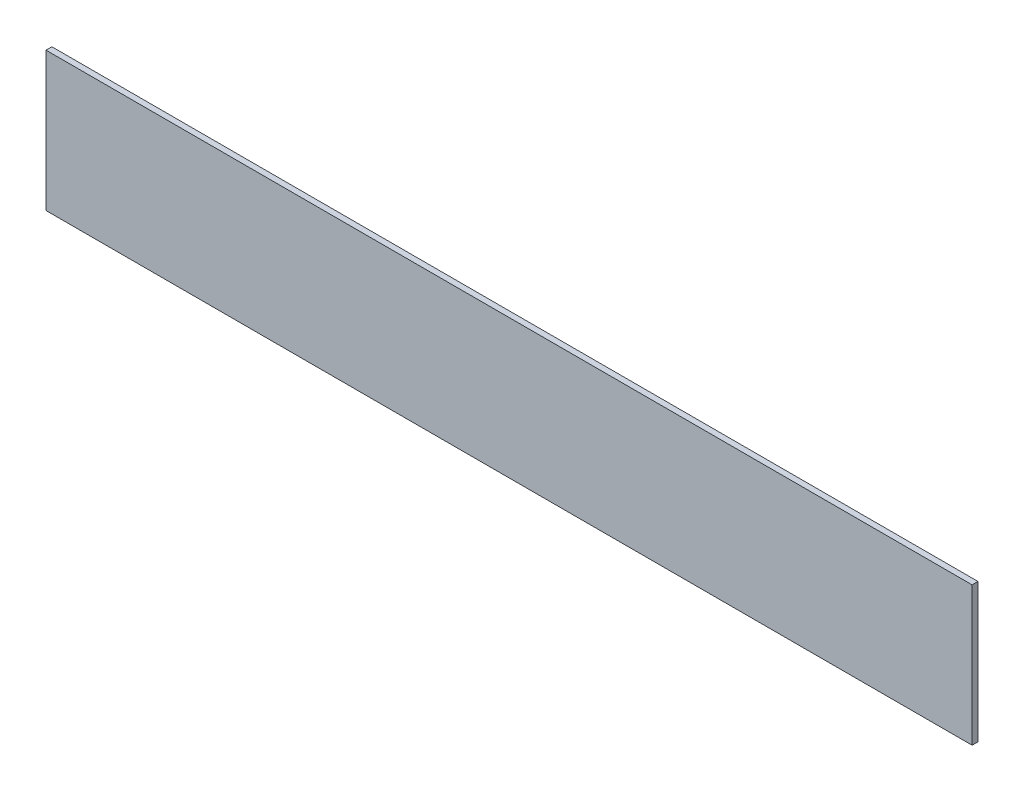
ISO-10303-21;
HEADER;
FILE_DESCRIPTION(('STEP AP214'),'2;1');
FILE_NAME('part.step','',(''),(''),'','','');
FILE_SCHEMA(('AUTOMOTIVE_DESIGN { 1 0 10303 214 1 1 1 1 }'));
ENDSEC;
DATA;
#1=APPLICATION_CONTEXT('core data for automotive mechanical design processes');
#2=APPLICATION_PROTOCOL_DEFINITION('international standard','automotive_design',2000,#1);
#3=PRODUCT_CONTEXT('',#1,'mechanical');
#4=PRODUCT('Part','Part','',(#3));
#5=PRODUCT_RELATED_PRODUCT_CATEGORY('part','',(#4));
#6=PRODUCT_DEFINITION_FORMATION('','',#4);
#7=PRODUCT_DEFINITION_CONTEXT('part definition',#1,'design');
#8=PRODUCT_DEFINITION('design','',#6,#7);
#9=PRODUCT_DEFINITION_SHAPE('','',#8);
#10=(LENGTH_UNIT() NAMED_UNIT(*) SI_UNIT(.MILLI.,.METRE.));
#11=(NAMED_UNIT(*) PLANE_ANGLE_UNIT() SI_UNIT($,.RADIAN.));
#12=(NAMED_UNIT(*) SI_UNIT($,.STERADIAN.) SOLID_ANGLE_UNIT());
#13=UNCERTAINTY_MEASURE_WITH_UNIT(LENGTH_MEASURE(1.E-05),#10,'distance_accuracy_value','');
#14=(GEOMETRIC_REPRESENTATION_CONTEXT(3) GLOBAL_UNCERTAINTY_ASSIGNED_CONTEXT((#13)) GLOBAL_UNIT_ASSIGNED_CONTEXT((#10,
#11,#12)) REPRESENTATION_CONTEXT('',''));
#15=CARTESIAN_POINT('',(0.,0.,0.));
#16=DIRECTION('',(0.,0.,1.));
#17=DIRECTION('',(1.,0.,0.));
#18=AXIS2_PLACEMENT_3D('',#15,#16,#17);
#19=CARTESIAN_POINT('',(250.,-37.5,1.5875));
#20=DIRECTION('',(-1.,0.,0.));
#21=DIRECTION('',(0.,0.,1.));
#22=AXIS2_PLACEMENT_3D('',#19,#20,#21);
#23=PLANE('',#22);
#24=DIRECTION('',(0.,1.,0.));
#25=VECTOR('',#24,1.);
#26=CARTESIAN_POINT('',(250.,-37.5,-1.5875));
#27=LINE('',#26,#25);
#28=CARTESIAN_POINT('',(250.,-37.5,-1.5875));
#29=VERTEX_POINT('',#28);
#30=CARTESIAN_POINT('',(250.,37.5,-1.5875));
#31=VERTEX_POINT('',#30);
#32=EDGE_CURVE('E96',#29,#31,#27,.T.);
#33=ORIENTED_EDGE('',*,*,#32,.T.);
#34=DIRECTION('',(0.,0.,-1.));
#35=VECTOR('',#34,1.);
#36=CARTESIAN_POINT('',(250.,37.5,1.5875));
#37=LINE('',#36,#35);
#38=CARTESIAN_POINT('',(250.,37.5,1.5875));
#39=VERTEX_POINT('',#38);
#40=EDGE_CURVE('E11',#39,#31,#37,.T.);
#41=ORIENTED_EDGE('',*,*,#40,.F.);
#42=DIRECTION('',(0.,1.,0.));
#43=VECTOR('',#42,1.);
#44=CARTESIAN_POINT('',(250.,-37.5,1.5875));
#45=LINE('',#44,#43);
#46=CARTESIAN_POINT('',(250.,-37.5,1.5875));
#47=VERTEX_POINT('',#46);
#48=EDGE_CURVE('E84',#47,#39,#45,.T.);
#49=ORIENTED_EDGE('',*,*,#48,.F.);
#50=DIRECTION('',(0.,0.,-1.));
#51=VECTOR('',#50,1.);
#52=CARTESIAN_POINT('',(250.,-37.5,1.5875));
#53=LINE('',#52,#51);
#54=EDGE_CURVE('E92',#47,#29,#53,.T.);
#55=ORIENTED_EDGE('',*,*,#54,.T.);
#56=EDGE_LOOP('',(#33,#41,#49,#55));
#57=FACE_BOUND('',#56,.T.);
#58=ADVANCED_FACE('F33',(#57),#23,.F.);
#59=CARTESIAN_POINT('',(-250.,37.5,1.5875));
#60=DIRECTION('',(0.,-1.,0.));
#61=DIRECTION('',(0.,0.,-1.));
#62=AXIS2_PLACEMENT_3D('',#59,#60,#61);
#63=PLANE('',#62);
#64=DIRECTION('',(-1.,0.,0.));
#65=VECTOR('',#64,1.);
#66=CARTESIAN_POINT('',(-250.,37.5,-1.5875));
#67=LINE('',#66,#65);
#68=CARTESIAN_POINT('',(-250.,37.5,-1.5875));
#69=VERTEX_POINT('',#68);
#70=EDGE_CURVE('E88',#31,#69,#67,.T.);
#71=ORIENTED_EDGE('',*,*,#70,.T.);
#72=DIRECTION('',(0.,0.,-1.));
#73=VECTOR('',#72,1.);
#74=CARTESIAN_POINT('',(-250.,37.5,1.5875));
#75=LINE('',#74,#73);
#76=CARTESIAN_POINT('',(-250.,37.5,1.5875));
#77=VERTEX_POINT('',#76);
#78=EDGE_CURVE('E41',#77,#69,#75,.T.);
#79=ORIENTED_EDGE('',*,*,#78,.F.);
#80=DIRECTION('',(-1.,0.,0.));
#81=VECTOR('',#80,1.);
#82=CARTESIAN_POINT('',(-250.,37.5,1.5875));
#83=LINE('',#82,#81);
#84=EDGE_CURVE('E79',#39,#77,#83,.T.);
#85=ORIENTED_EDGE('',*,*,#84,.F.);
#86=ORIENTED_EDGE('',*,*,#40,.T.);
#87=EDGE_LOOP('',(#71,#79,#85,#86));
#88=FACE_BOUND('',#87,.T.);
#89=ADVANCED_FACE('F87',(#88),#63,.F.);
#90=CARTESIAN_POINT('',(-250.,-37.5,1.5875));
#91=DIRECTION('',(1.,0.,0.));
#92=DIRECTION('',(0.,0.,-1.));
#93=AXIS2_PLACEMENT_3D('',#90,#91,#92);
#94=PLANE('',#93);
#95=DIRECTION('',(0.,-1.,0.));
#96=VECTOR('',#95,1.);
#97=CARTESIAN_POINT('',(-250.,-37.5,-1.5875));
#98=LINE('',#97,#96);
#99=CARTESIAN_POINT('',(-250.,-37.5,-1.5875));
#100=VERTEX_POINT('',#99);
#101=EDGE_CURVE('E66',#69,#100,#98,.T.);
#102=ORIENTED_EDGE('',*,*,#101,.T.);
#103=DIRECTION('',(0.,0.,-1.));
#104=VECTOR('',#103,1.);
#105=CARTESIAN_POINT('',(-250.,-37.5,1.5875));
#106=LINE('',#105,#104);
#107=CARTESIAN_POINT('',(-250.,-37.5,1.5875));
#108=VERTEX_POINT('',#107);
#109=EDGE_CURVE('E89',#108,#100,#106,.T.);
#110=ORIENTED_EDGE('',*,*,#109,.F.);
#111=DIRECTION('',(0.,-1.,0.));
#112=VECTOR('',#111,1.);
#113=CARTESIAN_POINT('',(-250.,-37.5,1.5875));
#114=LINE('',#113,#112);
#115=EDGE_CURVE('E82',#77,#108,#114,.T.);
#116=ORIENTED_EDGE('',*,*,#115,.F.);
#117=ORIENTED_EDGE('',*,*,#78,.T.);
#118=EDGE_LOOP('',(#102,#110,#116,#117));
#119=FACE_BOUND('',#118,.T.);
#120=ADVANCED_FACE('F90',(#119),#94,.F.);
#121=CARTESIAN_POINT('',(-250.,-37.5,1.5875));
#122=DIRECTION('',(0.,1.,0.));
#123=DIRECTION('',(0.,0.,1.));
#124=AXIS2_PLACEMENT_3D('',#121,#122,#123);
#125=PLANE('',#124);
#126=DIRECTION('',(1.,0.,0.));
#127=VECTOR('',#126,1.);
#128=CARTESIAN_POINT('',(-250.,-37.5,-1.5875));
#129=LINE('',#128,#127);
#130=EDGE_CURVE('E72',#100,#29,#129,.T.);
#131=ORIENTED_EDGE('',*,*,#130,.T.);
#132=ORIENTED_EDGE('',*,*,#54,.F.);
#133=DIRECTION('',(1.,0.,0.));
#134=VECTOR('',#133,1.);
#135=CARTESIAN_POINT('',(-250.,-37.5,1.5875));
#136=LINE('',#135,#134);
#137=EDGE_CURVE('E49',#108,#47,#136,.T.);
#138=ORIENTED_EDGE('',*,*,#137,.F.);
#139=ORIENTED_EDGE('',*,*,#109,.T.);
#140=EDGE_LOOP('',(#131,#132,#138,#139));
#141=FACE_BOUND('',#140,.T.);
#142=ADVANCED_FACE('F103',(#141),#125,.F.);
#143=CARTESIAN_POINT('',(0.,0.,1.5875));
#144=DIRECTION('',(0.,0.,-1.));
#145=DIRECTION('',(-1.,0.,0.));
#146=AXIS2_PLACEMENT_3D('',#143,#144,#145);
#147=PLANE('',#146);
#148=ORIENTED_EDGE('',*,*,#48,.T.);
#149=ORIENTED_EDGE('',*,*,#84,.T.);
#150=ORIENTED_EDGE('',*,*,#115,.T.);
#151=ORIENTED_EDGE('',*,*,#137,.T.);
#152=EDGE_LOOP('',(#148,#149,#150,#151));
#153=FACE_BOUND('',#152,.T.);
#154=ADVANCED_FACE('F80',(#153),#147,.F.);
#155=CARTESIAN_POINT('',(0.,0.,-1.5875));
#156=DIRECTION('',(0.,0.,-1.));
#157=DIRECTION('',(-1.,0.,0.));
#158=AXIS2_PLACEMENT_3D('',#155,#156,#157);
#159=PLANE('',#158);
#160=ORIENTED_EDGE('',*,*,#32,.F.);
#161=ORIENTED_EDGE('',*,*,#130,.F.);
#162=ORIENTED_EDGE('',*,*,#101,.F.);
#163=ORIENTED_EDGE('',*,*,#70,.F.);
#164=EDGE_LOOP('',(#160,#161,#162,#163));
#165=FACE_BOUND('',#164,.T.);
#166=ADVANCED_FACE('F106',(#165),#159,.T.);
#167=CLOSED_SHELL('',(#58,#89,#120,#142,#154,#166));
#168=MANIFOLD_SOLID_BREP('B2',#167);
#169=ADVANCED_BREP_SHAPE_REPRESENTATION('',(#18,#168),#14);
#170=SHAPE_DEFINITION_REPRESENTATION(#9,#169);
ENDSEC;
END-ISO-10303-21;
